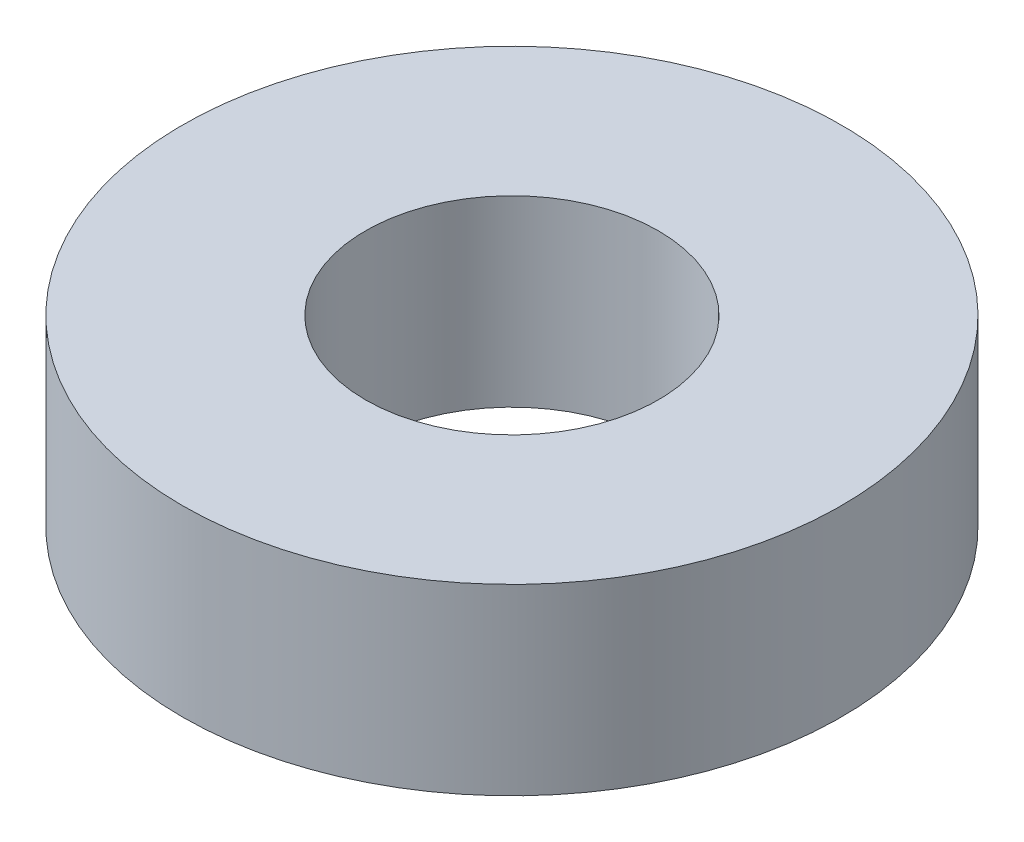
ISO-10303-21;
HEADER;
FILE_DESCRIPTION(('STEP AP214'),'2;1');
FILE_NAME('part.step','',(''),(''),'','','');
FILE_SCHEMA(('AUTOMOTIVE_DESIGN { 1 0 10303 214 1 1 1 1 }'));
ENDSEC;
DATA;
#1=APPLICATION_CONTEXT('core data for automotive mechanical design processes');
#2=APPLICATION_PROTOCOL_DEFINITION('international standard','automotive_design',2000,#1);
#3=PRODUCT_CONTEXT('',#1,'mechanical');
#4=PRODUCT('Part','Part','',(#3));
#5=PRODUCT_RELATED_PRODUCT_CATEGORY('part','',(#4));
#6=PRODUCT_DEFINITION_FORMATION('','',#4);
#7=PRODUCT_DEFINITION_CONTEXT('part definition',#1,'design');
#8=PRODUCT_DEFINITION('design','',#6,#7);
#9=PRODUCT_DEFINITION_SHAPE('','',#8);
#10=(LENGTH_UNIT() NAMED_UNIT(*) SI_UNIT(.MILLI.,.METRE.));
#11=(NAMED_UNIT(*) PLANE_ANGLE_UNIT() SI_UNIT($,.RADIAN.));
#12=(NAMED_UNIT(*) SI_UNIT($,.STERADIAN.) SOLID_ANGLE_UNIT());
#13=UNCERTAINTY_MEASURE_WITH_UNIT(LENGTH_MEASURE(1.E-05),#10,'distance_accuracy_value','');
#14=(GEOMETRIC_REPRESENTATION_CONTEXT(3) GLOBAL_UNCERTAINTY_ASSIGNED_CONTEXT((#13)) GLOBAL_UNIT_ASSIGNED_CONTEXT((#10,
#11,#12)) REPRESENTATION_CONTEXT('',''));
#15=CARTESIAN_POINT('',(0.,0.,0.));
#16=DIRECTION('',(0.,0.,1.));
#17=DIRECTION('',(1.,0.,0.));
#18=AXIS2_PLACEMENT_3D('',#15,#16,#17);
#19=CARTESIAN_POINT('',(0.,2.5,0.));
#20=DIRECTION('',(0.,1.,0.));
#21=DIRECTION('',(0.,0.,1.));
#22=AXIS2_PLACEMENT_3D('',#19,#20,#21);
#23=PLANE('',#22);
#24=CARTESIAN_POINT('',(0.,2.5,0.));
#25=DIRECTION('',(0.,1.,0.));
#26=DIRECTION('',(0.,0.,1.));
#27=AXIS2_PLACEMENT_3D('',#24,#25,#26);
#28=CIRCLE('',#27,4.5);
#29=CARTESIAN_POINT('',(0.,2.5,4.5));
#30=VERTEX_POINT('',#29);
#31=EDGE_CURVE('E10',#30,#30,#28,.T.);
#32=ORIENTED_EDGE('',*,*,#31,.T.);
#33=EDGE_LOOP('',(#32));
#34=FACE_BOUND('',#33,.T.);
#35=CARTESIAN_POINT('',(0.,2.5,0.));
#36=DIRECTION('',(0.,1.,0.));
#37=DIRECTION('',(0.,0.,1.));
#38=AXIS2_PLACEMENT_3D('',#35,#36,#37);
#39=CIRCLE('',#38,2.);
#40=CARTESIAN_POINT('',(0.,2.5,2.));
#41=VERTEX_POINT('',#40);
#42=EDGE_CURVE('E56',#41,#41,#39,.T.);
#43=ORIENTED_EDGE('',*,*,#42,.F.);
#44=EDGE_LOOP('',(#43));
#45=FACE_BOUND('',#44,.T.);
#46=ADVANCED_FACE('F43',(#34,#45),#23,.T.);
#47=CARTESIAN_POINT('',(0.,0.,0.));
#48=DIRECTION('',(0.,1.,0.));
#49=DIRECTION('',(0.,0.,1.));
#50=AXIS2_PLACEMENT_3D('',#47,#48,#49);
#51=PLANE('',#50);
#52=CARTESIAN_POINT('',(0.,0.,0.));
#53=DIRECTION('',(0.,1.,0.));
#54=DIRECTION('',(0.,0.,1.));
#55=AXIS2_PLACEMENT_3D('',#52,#53,#54);
#56=CIRCLE('',#55,4.5);
#57=CARTESIAN_POINT('',(0.,0.,4.5));
#58=VERTEX_POINT('',#57);
#59=EDGE_CURVE('E47',#58,#58,#56,.T.);
#60=ORIENTED_EDGE('',*,*,#59,.F.);
#61=EDGE_LOOP('',(#60));
#62=FACE_BOUND('',#61,.T.);
#63=CARTESIAN_POINT('',(0.,0.,0.));
#64=DIRECTION('',(0.,1.,0.));
#65=DIRECTION('',(0.,0.,1.));
#66=AXIS2_PLACEMENT_3D('',#63,#64,#65);
#67=CIRCLE('',#66,2.);
#68=CARTESIAN_POINT('',(0.,0.,2.));
#69=VERTEX_POINT('',#68);
#70=EDGE_CURVE('E58',#69,#69,#67,.T.);
#71=ORIENTED_EDGE('',*,*,#70,.T.);
#72=EDGE_LOOP('',(#71));
#73=FACE_BOUND('',#72,.T.);
#74=ADVANCED_FACE('F70',(#62,#73),#51,.F.);
#75=CARTESIAN_POINT('',(0.,2.5,0.));
#76=DIRECTION('',(0.,-1.,0.));
#77=DIRECTION('',(0.,0.,-1.));
#78=AXIS2_PLACEMENT_3D('',#75,#76,#77);
#79=CYLINDRICAL_SURFACE('',#78,4.5);
#80=ORIENTED_EDGE('',*,*,#31,.F.);
#81=EDGE_LOOP('',(#80));
#82=FACE_BOUND('',#81,.T.);
#83=ORIENTED_EDGE('',*,*,#59,.T.);
#84=EDGE_LOOP('',(#83));
#85=FACE_BOUND('',#84,.T.);
#86=ADVANCED_FACE('F45',(#82,#85),#79,.T.);
#87=CARTESIAN_POINT('',(0.,2.5,0.));
#88=DIRECTION('',(0.,-1.,0.));
#89=DIRECTION('',(0.,0.,-1.));
#90=AXIS2_PLACEMENT_3D('',#87,#88,#89);
#91=CYLINDRICAL_SURFACE('',#90,2.);
#92=ORIENTED_EDGE('',*,*,#42,.T.);
#93=EDGE_LOOP('',(#92));
#94=FACE_BOUND('',#93,.T.);
#95=ORIENTED_EDGE('',*,*,#70,.F.);
#96=EDGE_LOOP('',(#95));
#97=FACE_BOUND('',#96,.T.);
#98=ADVANCED_FACE('F66',(#94,#97),#91,.F.);
#99=CLOSED_SHELL('',(#46,#74,#86,#98));
#100=MANIFOLD_SOLID_BREP('B2',#99);
#101=ADVANCED_BREP_SHAPE_REPRESENTATION('',(#18,#100),#14);
#102=SHAPE_DEFINITION_REPRESENTATION(#9,#101);
ENDSEC;
END-ISO-10303-21;
